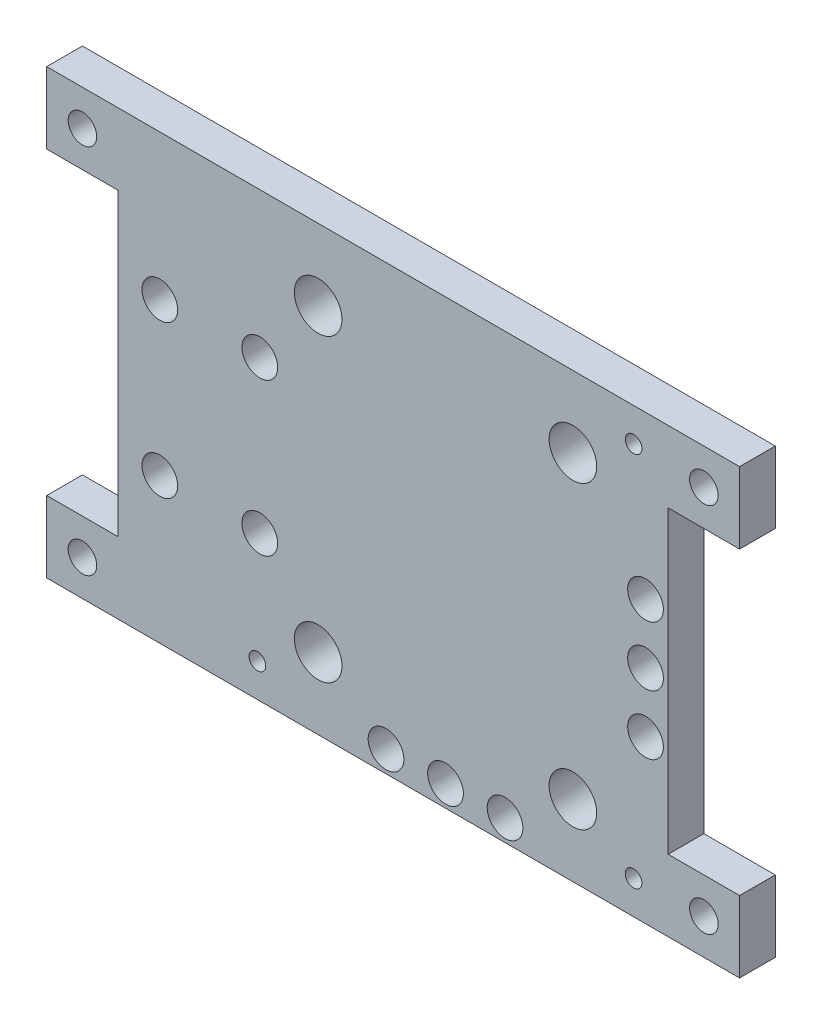
ISO-10303-21;
HEADER;
FILE_DESCRIPTION(('STEP AP214'),'2;1');
FILE_NAME('part.step','',(''),(''),'','','');
FILE_SCHEMA(('AUTOMOTIVE_DESIGN { 1 0 10303 214 1 1 1 1 }'));
ENDSEC;
DATA;
#1=APPLICATION_CONTEXT('core data for automotive mechanical design processes');
#2=APPLICATION_PROTOCOL_DEFINITION('international standard','automotive_design',2000,#1);
#3=PRODUCT_CONTEXT('',#1,'mechanical');
#4=PRODUCT('Part','Part','',(#3));
#5=PRODUCT_RELATED_PRODUCT_CATEGORY('part','',(#4));
#6=PRODUCT_DEFINITION_FORMATION('','',#4);
#7=PRODUCT_DEFINITION_CONTEXT('part definition',#1,'design');
#8=PRODUCT_DEFINITION('design','',#6,#7);
#9=PRODUCT_DEFINITION_SHAPE('','',#8);
#10=(LENGTH_UNIT() NAMED_UNIT(*) SI_UNIT(.MILLI.,.METRE.));
#11=(NAMED_UNIT(*) PLANE_ANGLE_UNIT() SI_UNIT($,.RADIAN.));
#12=(NAMED_UNIT(*) SI_UNIT($,.STERADIAN.) SOLID_ANGLE_UNIT());
#13=UNCERTAINTY_MEASURE_WITH_UNIT(LENGTH_MEASURE(1.E-05),#10,'distance_accuracy_value','');
#14=(GEOMETRIC_REPRESENTATION_CONTEXT(3) GLOBAL_UNCERTAINTY_ASSIGNED_CONTEXT((#13)) GLOBAL_UNIT_ASSIGNED_CONTEXT((#10,
#11,#12)) REPRESENTATION_CONTEXT('',''));
#15=CARTESIAN_POINT('',(0.,0.,0.));
#16=DIRECTION('',(0.,0.,1.));
#17=DIRECTION('',(1.,0.,0.));
#18=AXIS2_PLACEMENT_3D('',#15,#16,#17);
#19=CARTESIAN_POINT('',(-11.55,9.3,1.5));
#20=DIRECTION('',(1.,0.,0.));
#21=DIRECTION('',(0.,1.,0.));
#22=AXIS2_PLACEMENT_3D('',#19,#20,#21);
#23=PLANE('',#22);
#24=DIRECTION('',(0.,0.,-1.));
#25=VECTOR('',#24,1.);
#26=CARTESIAN_POINT('',(-11.55,-6.3,1.5));
#27=LINE('',#26,#25);
#28=CARTESIAN_POINT('',(-11.55,-6.3,1.5));
#29=VERTEX_POINT('',#28);
#30=CARTESIAN_POINT('',(-11.55,-6.3,0.));
#31=VERTEX_POINT('',#30);
#32=EDGE_CURVE('E116',#29,#31,#27,.T.);
#33=ORIENTED_EDGE('',*,*,#32,.F.);
#34=DIRECTION('',(0.,-1.,0.));
#35=VECTOR('',#34,1.);
#36=CARTESIAN_POINT('',(-11.55,9.3,1.5));
#37=LINE('',#36,#35);
#38=CARTESIAN_POINT('',(-11.55,6.3,1.5));
#39=VERTEX_POINT('',#38);
#40=EDGE_CURVE('E12',#39,#29,#37,.T.);
#41=ORIENTED_EDGE('',*,*,#40,.F.);
#42=DIRECTION('',(0.,0.,-1.));
#43=VECTOR('',#42,1.);
#44=CARTESIAN_POINT('',(-11.55,6.3,1.5));
#45=LINE('',#44,#43);
#46=CARTESIAN_POINT('',(-11.55,6.3,0.));
#47=VERTEX_POINT('',#46);
#48=EDGE_CURVE('E229',#39,#47,#45,.T.);
#49=ORIENTED_EDGE('',*,*,#48,.T.);
#50=DIRECTION('',(0.,-1.,0.));
#51=VECTOR('',#50,1.);
#52=CARTESIAN_POINT('',(-11.55,9.3,0.));
#53=LINE('',#52,#51);
#54=EDGE_CURVE('E103',#47,#31,#53,.T.);
#55=ORIENTED_EDGE('',*,*,#54,.T.);
#56=EDGE_LOOP('',(#33,#41,#49,#55));
#57=FACE_BOUND('',#56,.T.);
#58=ADVANCED_FACE('F99',(#57),#23,.F.);
#59=CARTESIAN_POINT('',(11.55,9.3,1.5));
#60=DIRECTION('',(1.,0.,0.));
#61=DIRECTION('',(0.,0.,-1.));
#62=AXIS2_PLACEMENT_3D('',#59,#60,#61);
#63=PLANE('',#62);
#64=DIRECTION('',(0.,-1.,0.));
#65=VECTOR('',#64,1.);
#66=CARTESIAN_POINT('',(11.55,9.3,0.));
#67=LINE('',#66,#65);
#68=CARTESIAN_POINT('',(11.55,6.3,0.));
#69=VERTEX_POINT('',#68);
#70=CARTESIAN_POINT('',(11.55,-6.3,0.));
#71=VERTEX_POINT('',#70);
#72=EDGE_CURVE('E201',#69,#71,#67,.T.);
#73=ORIENTED_EDGE('',*,*,#72,.F.);
#74=DIRECTION('',(0.,0.,-1.));
#75=VECTOR('',#74,1.);
#76=CARTESIAN_POINT('',(11.55,6.3,1.5));
#77=LINE('',#76,#75);
#78=CARTESIAN_POINT('',(11.55,6.3,1.5));
#79=VERTEX_POINT('',#78);
#80=EDGE_CURVE('E250',#79,#69,#77,.T.);
#81=ORIENTED_EDGE('',*,*,#80,.F.);
#82=DIRECTION('',(0.,-1.,0.));
#83=VECTOR('',#82,1.);
#84=CARTESIAN_POINT('',(11.55,9.3,1.5));
#85=LINE('',#84,#83);
#86=CARTESIAN_POINT('',(11.55,-6.3,1.5));
#87=VERTEX_POINT('',#86);
#88=EDGE_CURVE('E402',#79,#87,#85,.T.);
#89=ORIENTED_EDGE('',*,*,#88,.T.);
#90=DIRECTION('',(0.,0.,-1.));
#91=VECTOR('',#90,1.);
#92=CARTESIAN_POINT('',(11.55,-6.3,1.5));
#93=LINE('',#92,#91);
#94=EDGE_CURVE('E288',#87,#71,#93,.T.);
#95=ORIENTED_EDGE('',*,*,#94,.T.);
#96=EDGE_LOOP('',(#73,#81,#89,#95));
#97=FACE_BOUND('',#96,.T.);
#98=ADVANCED_FACE('F416',(#97),#63,.T.);
#99=CARTESIAN_POINT('',(-11.55,9.3,1.5));
#100=DIRECTION('',(0.,1.,0.));
#101=DIRECTION('',(0.,0.,1.));
#102=AXIS2_PLACEMENT_3D('',#99,#100,#101);
#103=PLANE('',#102);
#104=DIRECTION('',(1.,0.,0.));
#105=VECTOR('',#104,1.);
#106=CARTESIAN_POINT('',(-11.55,9.3,0.));
#107=LINE('',#106,#105);
#108=CARTESIAN_POINT('',(-14.55,9.3,0.));
#109=VERTEX_POINT('',#108);
#110=CARTESIAN_POINT('',(14.55,9.3,0.));
#111=VERTEX_POINT('',#110);
#112=EDGE_CURVE('E397',#109,#111,#107,.T.);
#113=ORIENTED_EDGE('',*,*,#112,.F.);
#114=DIRECTION('',(0.,0.,-1.));
#115=VECTOR('',#114,1.);
#116=CARTESIAN_POINT('',(-14.55,9.3,1.5));
#117=LINE('',#116,#115);
#118=CARTESIAN_POINT('',(-14.55,9.3,1.5));
#119=VERTEX_POINT('',#118);
#120=EDGE_CURVE('E226',#119,#109,#117,.T.);
#121=ORIENTED_EDGE('',*,*,#120,.F.);
#122=DIRECTION('',(1.,0.,0.));
#123=VECTOR('',#122,1.);
#124=CARTESIAN_POINT('',(-11.55,9.3,1.5));
#125=LINE('',#124,#123);
#126=CARTESIAN_POINT('',(14.55,9.3,1.5));
#127=VERTEX_POINT('',#126);
#128=EDGE_CURVE('E400',#119,#127,#125,.T.);
#129=ORIENTED_EDGE('',*,*,#128,.T.);
#130=DIRECTION('',(0.,0.,-1.));
#131=VECTOR('',#130,1.);
#132=CARTESIAN_POINT('',(14.55,9.3,1.5));
#133=LINE('',#132,#131);
#134=EDGE_CURVE('E256',#127,#111,#133,.T.);
#135=ORIENTED_EDGE('',*,*,#134,.T.);
#136=EDGE_LOOP('',(#113,#121,#129,#135));
#137=FACE_BOUND('',#136,.T.);
#138=ADVANCED_FACE('F101',(#137),#103,.T.);
#139=CARTESIAN_POINT('',(-11.55,-9.3,1.5));
#140=DIRECTION('',(0.,1.,0.));
#141=DIRECTION('',(0.,0.,1.));
#142=AXIS2_PLACEMENT_3D('',#139,#140,#141);
#143=PLANE('',#142);
#144=DIRECTION('',(1.,0.,0.));
#145=VECTOR('',#144,1.);
#146=CARTESIAN_POINT('',(-11.55,-9.3,0.));
#147=LINE('',#146,#145);
#148=CARTESIAN_POINT('',(-14.55,-9.3,0.));
#149=VERTEX_POINT('',#148);
#150=CARTESIAN_POINT('',(14.55,-9.3,0.));
#151=VERTEX_POINT('',#150);
#152=EDGE_CURVE('E189',#149,#151,#147,.T.);
#153=ORIENTED_EDGE('',*,*,#152,.T.);
#154=DIRECTION('',(0.,0.,-1.));
#155=VECTOR('',#154,1.);
#156=CARTESIAN_POINT('',(14.55,-9.3,1.5));
#157=LINE('',#156,#155);
#158=CARTESIAN_POINT('',(14.55,-9.3,1.5));
#159=VERTEX_POINT('',#158);
#160=EDGE_CURVE('E291',#159,#151,#157,.T.);
#161=ORIENTED_EDGE('',*,*,#160,.F.);
#162=DIRECTION('',(1.,0.,0.));
#163=VECTOR('',#162,1.);
#164=CARTESIAN_POINT('',(-11.55,-9.3,1.5));
#165=LINE('',#164,#163);
#166=CARTESIAN_POINT('',(-14.55,-9.3,1.5));
#167=VERTEX_POINT('',#166);
#168=EDGE_CURVE('E108',#167,#159,#165,.T.);
#169=ORIENTED_EDGE('',*,*,#168,.F.);
#170=DIRECTION('',(0.,0.,-1.));
#171=VECTOR('',#170,1.);
#172=CARTESIAN_POINT('',(-14.55,-9.3,1.5));
#173=LINE('',#172,#171);
#174=EDGE_CURVE('E203',#167,#149,#173,.T.);
#175=ORIENTED_EDGE('',*,*,#174,.T.);
#176=EDGE_LOOP('',(#153,#161,#169,#175));
#177=FACE_BOUND('',#176,.T.);
#178=ADVANCED_FACE('F204',(#177),#143,.F.);
#179=CARTESIAN_POINT('',(0.,0.,1.5));
#180=DIRECTION('',(0.,0.,-1.));
#181=DIRECTION('',(-1.,0.,0.));
#182=AXIS2_PLACEMENT_3D('',#179,#180,#181);
#183=PLANE('',#182);
#184=CARTESIAN_POINT('',(-5.6,3.19999999999996,1.5));
#185=DIRECTION('',(0.,0.,-1.));
#186=DIRECTION('',(-1.,0.,0.));
#187=AXIS2_PLACEMENT_3D('',#184,#185,#186);
#188=CIRCLE('',#187,0.75);
#189=CARTESIAN_POINT('',(-6.35,3.19999999999996,1.5));
#190=VERTEX_POINT('',#189);
#191=EDGE_CURVE('E301',#190,#190,#188,.T.);
#192=ORIENTED_EDGE('',*,*,#191,.T.);
#193=EDGE_LOOP('',(#192));
#194=FACE_BOUND('',#193,.T.);
#195=CARTESIAN_POINT('',(-3.15,6.29999999999996,1.5));
#196=DIRECTION('',(0.,0.,-1.));
#197=DIRECTION('',(-1.,0.,0.));
#198=AXIS2_PLACEMENT_3D('',#195,#196,#197);
#199=CIRCLE('',#198,0.999999999999999);
#200=CARTESIAN_POINT('',(-4.15,6.29999999999996,1.5));
#201=VERTEX_POINT('',#200);
#202=EDGE_CURVE('E362',#201,#201,#199,.T.);
#203=ORIENTED_EDGE('',*,*,#202,.T.);
#204=EDGE_LOOP('',(#203));
#205=FACE_BOUND('',#204,.T.);
#206=CARTESIAN_POINT('',(10.1,7.89999999999996,1.5));
#207=DIRECTION('',(0.,0.,-1.));
#208=DIRECTION('',(-1.,0.,0.));
#209=AXIS2_PLACEMENT_3D('',#206,#207,#208);
#210=CIRCLE('',#209,0.349999999999999);
#211=CARTESIAN_POINT('',(9.74999999999998,7.89999999999996,1.5));
#212=VERTEX_POINT('',#211);
#213=EDGE_CURVE('E356',#212,#212,#210,.T.);
#214=ORIENTED_EDGE('',*,*,#213,.T.);
#215=EDGE_LOOP('',(#214));
#216=FACE_BOUND('',#215,.T.);
#217=CARTESIAN_POINT('',(7.55,6.29999999999996,1.5));
#218=DIRECTION('',(0.,0.,-1.));
#219=DIRECTION('',(-1.,0.,0.));
#220=AXIS2_PLACEMENT_3D('',#217,#218,#219);
#221=CIRCLE('',#220,1.);
#222=CARTESIAN_POINT('',(6.55,6.29999999999996,1.5));
#223=VERTEX_POINT('',#222);
#224=EDGE_CURVE('E350',#223,#223,#221,.T.);
#225=ORIENTED_EDGE('',*,*,#224,.T.);
#226=EDGE_LOOP('',(#225));
#227=FACE_BOUND('',#226,.T.);
#228=CARTESIAN_POINT('',(10.6,2.49999999999996,1.5));
#229=DIRECTION('',(0.,0.,-1.));
#230=DIRECTION('',(-1.,0.,0.));
#231=AXIS2_PLACEMENT_3D('',#228,#229,#230);
#232=CIRCLE('',#231,0.75);
#233=CARTESIAN_POINT('',(9.85,2.49999999999996,1.5));
#234=VERTEX_POINT('',#233);
#235=EDGE_CURVE('E349',#234,#234,#232,.T.);
#236=ORIENTED_EDGE('',*,*,#235,.T.);
#237=EDGE_LOOP('',(#236));
#238=FACE_BOUND('',#237,.T.);
#239=CARTESIAN_POINT('',(10.6,0.,1.5));
#240=DIRECTION('',(0.,0.,-1.));
#241=DIRECTION('',(-1.,0.,0.));
#242=AXIS2_PLACEMENT_3D('',#239,#240,#241);
#243=CIRCLE('',#242,0.75);
#244=CARTESIAN_POINT('',(9.85,0.,1.5));
#245=VERTEX_POINT('',#244);
#246=EDGE_CURVE('E386',#245,#245,#243,.T.);
#247=ORIENTED_EDGE('',*,*,#246,.T.);
#248=EDGE_LOOP('',(#247));
#249=FACE_BOUND('',#248,.T.);
#250=CARTESIAN_POINT('',(10.6,-2.50000000000004,1.5));
#251=DIRECTION('',(0.,0.,-1.));
#252=DIRECTION('',(-1.,0.,0.));
#253=AXIS2_PLACEMENT_3D('',#250,#251,#252);
#254=CIRCLE('',#253,0.75);
#255=CARTESIAN_POINT('',(9.85,-2.50000000000004,1.5));
#256=VERTEX_POINT('',#255);
#257=EDGE_CURVE('E380',#256,#256,#254,.T.);
#258=ORIENTED_EDGE('',*,*,#257,.T.);
#259=EDGE_LOOP('',(#258));
#260=FACE_BOUND('',#259,.T.);
#261=CARTESIAN_POINT('',(7.55,-6.30000000000004,1.5));
#262=DIRECTION('',(0.,0.,-1.));
#263=DIRECTION('',(-1.,0.,0.));
#264=AXIS2_PLACEMENT_3D('',#261,#262,#263);
#265=CIRCLE('',#264,1.);
#266=CARTESIAN_POINT('',(6.55,-6.30000000000004,1.5));
#267=VERTEX_POINT('',#266);
#268=EDGE_CURVE('E374',#267,#267,#265,.T.);
#269=ORIENTED_EDGE('',*,*,#268,.T.);
#270=EDGE_LOOP('',(#269));
#271=FACE_BOUND('',#270,.T.);
#272=CARTESIAN_POINT('',(-9.8,3.19999999999996,1.5));
#273=DIRECTION('',(0.,0.,-1.));
#274=DIRECTION('',(-1.,0.,0.));
#275=AXIS2_PLACEMENT_3D('',#272,#273,#274);
#276=CIRCLE('',#275,0.75);
#277=CARTESIAN_POINT('',(-10.55,3.19999999999996,1.5));
#278=VERTEX_POINT('',#277);
#279=EDGE_CURVE('E302',#278,#278,#276,.T.);
#280=ORIENTED_EDGE('',*,*,#279,.T.);
#281=EDGE_LOOP('',(#280));
#282=FACE_BOUND('',#281,.T.);
#283=CARTESIAN_POINT('',(-9.8,-3.20000000000004,1.5));
#284=DIRECTION('',(0.,0.,-1.));
#285=DIRECTION('',(-1.,0.,0.));
#286=AXIS2_PLACEMENT_3D('',#283,#284,#285);
#287=CIRCLE('',#286,0.75);
#288=CARTESIAN_POINT('',(-10.55,-3.20000000000004,1.5));
#289=VERTEX_POINT('',#288);
#290=EDGE_CURVE('E308',#289,#289,#287,.T.);
#291=ORIENTED_EDGE('',*,*,#290,.T.);
#292=EDGE_LOOP('',(#291));
#293=FACE_BOUND('',#292,.T.);
#294=CARTESIAN_POINT('',(-5.6,-3.20000000000004,1.5));
#295=DIRECTION('',(0.,0.,-1.));
#296=DIRECTION('',(-1.,0.,0.));
#297=AXIS2_PLACEMENT_3D('',#294,#295,#296);
#298=CIRCLE('',#297,0.75);
#299=CARTESIAN_POINT('',(-6.35,-3.20000000000004,1.5));
#300=VERTEX_POINT('',#299);
#301=EDGE_CURVE('E314',#300,#300,#298,.T.);
#302=ORIENTED_EDGE('',*,*,#301,.T.);
#303=EDGE_LOOP('',(#302));
#304=FACE_BOUND('',#303,.T.);
#305=CARTESIAN_POINT('',(-3.15,-6.30000000000004,1.5));
#306=DIRECTION('',(0.,0.,-1.));
#307=DIRECTION('',(-1.,0.,0.));
#308=AXIS2_PLACEMENT_3D('',#305,#306,#307);
#309=CIRCLE('',#308,0.999999999999999);
#310=CARTESIAN_POINT('',(-4.15,-6.30000000000004,1.5));
#311=VERTEX_POINT('',#310);
#312=EDGE_CURVE('E320',#311,#311,#309,.T.);
#313=ORIENTED_EDGE('',*,*,#312,.T.);
#314=EDGE_LOOP('',(#313));
#315=FACE_BOUND('',#314,.T.);
#316=CARTESIAN_POINT('',(-5.7,-7.89999999999966,1.5));
#317=DIRECTION('',(0.,0.,-1.));
#318=DIRECTION('',(-1.,0.,0.));
#319=AXIS2_PLACEMENT_3D('',#316,#317,#318);
#320=CIRCLE('',#319,0.35);
#321=CARTESIAN_POINT('',(-6.05,-7.89999999999966,1.5));
#322=VERTEX_POINT('',#321);
#323=EDGE_CURVE('E326',#322,#322,#320,.T.);
#324=ORIENTED_EDGE('',*,*,#323,.T.);
#325=EDGE_LOOP('',(#324));
#326=FACE_BOUND('',#325,.T.);
#327=CARTESIAN_POINT('',(-0.299999999999998,-8.40000000000004,1.5));
#328=DIRECTION('',(0.,0.,-1.));
#329=DIRECTION('',(-1.,0.,0.));
#330=AXIS2_PLACEMENT_3D('',#327,#328,#329);
#331=CIRCLE('',#330,0.750000000000001);
#332=CARTESIAN_POINT('',(-1.05,-8.40000000000004,1.5));
#333=VERTEX_POINT('',#332);
#334=EDGE_CURVE('E332',#333,#333,#331,.T.);
#335=ORIENTED_EDGE('',*,*,#334,.T.);
#336=EDGE_LOOP('',(#335));
#337=FACE_BOUND('',#336,.T.);
#338=CARTESIAN_POINT('',(2.2,-8.40000000000004,1.5));
#339=DIRECTION('',(0.,0.,-1.));
#340=DIRECTION('',(-1.,0.,0.));
#341=AXIS2_PLACEMENT_3D('',#338,#339,#340);
#342=CIRCLE('',#341,0.750000000000001);
#343=CARTESIAN_POINT('',(1.45,-8.40000000000004,1.5));
#344=VERTEX_POINT('',#343);
#345=EDGE_CURVE('E338',#344,#344,#342,.T.);
#346=ORIENTED_EDGE('',*,*,#345,.T.);
#347=EDGE_LOOP('',(#346));
#348=FACE_BOUND('',#347,.T.);
#349=CARTESIAN_POINT('',(4.7,-8.40000000000004,1.5));
#350=DIRECTION('',(0.,0.,-1.));
#351=DIRECTION('',(-1.,0.,0.));
#352=AXIS2_PLACEMENT_3D('',#349,#350,#351);
#353=CIRCLE('',#352,0.75);
#354=CARTESIAN_POINT('',(3.95,-8.40000000000004,1.5));
#355=VERTEX_POINT('',#354);
#356=EDGE_CURVE('E293',#355,#355,#353,.T.);
#357=ORIENTED_EDGE('',*,*,#356,.T.);
#358=EDGE_LOOP('',(#357));
#359=FACE_BOUND('',#358,.T.);
#360=CARTESIAN_POINT('',(10.1,-7.90000000000003,1.5));
#361=DIRECTION('',(0.,0.,-1.));
#362=DIRECTION('',(-1.,0.,0.));
#363=AXIS2_PLACEMENT_3D('',#360,#361,#362);
#364=CIRCLE('',#363,0.349999999999999);
#365=CARTESIAN_POINT('',(9.74999999999998,-7.90000000000003,1.5));
#366=VERTEX_POINT('',#365);
#367=EDGE_CURVE('E394',#366,#366,#364,.T.);
#368=ORIENTED_EDGE('',*,*,#367,.T.);
#369=EDGE_LOOP('',(#368));
#370=FACE_BOUND('',#369,.T.);
#371=ORIENTED_EDGE('',*,*,#128,.F.);
#372=DIRECTION('',(0.,-1.,0.));
#373=VECTOR('',#372,1.);
#374=CARTESIAN_POINT('',(-14.55,9.3,1.5));
#375=LINE('',#374,#373);
#376=CARTESIAN_POINT('',(-14.55,6.3,1.5));
#377=VERTEX_POINT('',#376);
#378=EDGE_CURVE('E231',#119,#377,#375,.T.);
#379=ORIENTED_EDGE('',*,*,#378,.T.);
#380=DIRECTION('',(-1.,0.,0.));
#381=VECTOR('',#380,1.);
#382=CARTESIAN_POINT('',(-11.55,6.3,1.5));
#383=LINE('',#382,#381);
#384=EDGE_CURVE('E240',#39,#377,#383,.T.);
#385=ORIENTED_EDGE('',*,*,#384,.F.);
#386=ORIENTED_EDGE('',*,*,#40,.T.);
#387=DIRECTION('',(-1.,0.,0.));
#388=VECTOR('',#387,1.);
#389=CARTESIAN_POINT('',(-11.55,-6.3,1.5));
#390=LINE('',#389,#388);
#391=CARTESIAN_POINT('',(-14.55,-6.3,1.5));
#392=VERTEX_POINT('',#391);
#393=EDGE_CURVE('E215',#29,#392,#390,.T.);
#394=ORIENTED_EDGE('',*,*,#393,.T.);
#395=DIRECTION('',(0.,1.,0.));
#396=VECTOR('',#395,1.);
#397=CARTESIAN_POINT('',(-14.55,-9.3,1.5));
#398=LINE('',#397,#396);
#399=EDGE_CURVE('E208',#167,#392,#398,.T.);
#400=ORIENTED_EDGE('',*,*,#399,.F.);
#401=ORIENTED_EDGE('',*,*,#168,.T.);
#402=DIRECTION('',(0.,1.,0.));
#403=VECTOR('',#402,1.);
#404=CARTESIAN_POINT('',(14.55,-9.3,1.5));
#405=LINE('',#404,#403);
#406=CARTESIAN_POINT('',(14.55,-6.3,1.5));
#407=VERTEX_POINT('',#406);
#408=EDGE_CURVE('E286',#159,#407,#405,.T.);
#409=ORIENTED_EDGE('',*,*,#408,.T.);
#410=DIRECTION('',(1.,0.,0.));
#411=VECTOR('',#410,1.);
#412=CARTESIAN_POINT('',(11.55,-6.3,1.5));
#413=LINE('',#412,#411);
#414=EDGE_CURVE('E283',#87,#407,#413,.T.);
#415=ORIENTED_EDGE('',*,*,#414,.F.);
#416=ORIENTED_EDGE('',*,*,#88,.F.);
#417=DIRECTION('',(1.,0.,0.));
#418=VECTOR('',#417,1.);
#419=CARTESIAN_POINT('',(11.55,6.3,1.5));
#420=LINE('',#419,#418);
#421=CARTESIAN_POINT('',(14.55,6.3,1.5));
#422=VERTEX_POINT('',#421);
#423=EDGE_CURVE('E264',#79,#422,#420,.T.);
#424=ORIENTED_EDGE('',*,*,#423,.T.);
#425=DIRECTION('',(0.,-1.,0.));
#426=VECTOR('',#425,1.);
#427=CARTESIAN_POINT('',(14.55,9.3,1.5));
#428=LINE('',#427,#426);
#429=EDGE_CURVE('E259',#127,#422,#428,.T.);
#430=ORIENTED_EDGE('',*,*,#429,.F.);
#431=EDGE_LOOP('',(#371,#379,#385,#386,#394,#400,#401,#409,#415,#416,#424,#430));
#432=FACE_BOUND('',#431,.T.);
#433=CARTESIAN_POINT('',(13.05,-7.8,1.5));
#434=DIRECTION('',(0.,0.,-1.));
#435=DIRECTION('',(-1.,0.,0.));
#436=AXIS2_PLACEMENT_3D('',#433,#434,#435);
#437=CIRCLE('',#436,0.6);
#438=CARTESIAN_POINT('',(12.45,-7.8,1.5));
#439=VERTEX_POINT('',#438);
#440=EDGE_CURVE('E277',#439,#439,#437,.T.);
#441=ORIENTED_EDGE('',*,*,#440,.T.);
#442=EDGE_LOOP('',(#441));
#443=FACE_BOUND('',#442,.T.);
#444=CARTESIAN_POINT('',(13.05,7.8,1.5));
#445=DIRECTION('',(0.,0.,-1.));
#446=DIRECTION('',(-1.,0.,0.));
#447=AXIS2_PLACEMENT_3D('',#444,#445,#446);
#448=CIRCLE('',#447,0.6);
#449=CARTESIAN_POINT('',(12.45,7.8,1.5));
#450=VERTEX_POINT('',#449);
#451=EDGE_CURVE('E267',#450,#450,#448,.T.);
#452=ORIENTED_EDGE('',*,*,#451,.T.);
#453=EDGE_LOOP('',(#452));
#454=FACE_BOUND('',#453,.T.);
#455=CARTESIAN_POINT('',(-13.05,7.8,1.5));
#456=DIRECTION('',(0.,0.,-1.));
#457=DIRECTION('',(-1.,0.,0.));
#458=AXIS2_PLACEMENT_3D('',#455,#456,#457);
#459=CIRCLE('',#458,0.6);
#460=CARTESIAN_POINT('',(-13.65,7.8,1.5));
#461=VERTEX_POINT('',#460);
#462=EDGE_CURVE('E243',#461,#461,#459,.T.);
#463=ORIENTED_EDGE('',*,*,#462,.T.);
#464=EDGE_LOOP('',(#463));
#465=FACE_BOUND('',#464,.T.);
#466=CARTESIAN_POINT('',(-13.05,-7.8,1.5));
#467=DIRECTION('',(0.,0.,-1.));
#468=DIRECTION('',(-1.,0.,0.));
#469=AXIS2_PLACEMENT_3D('',#466,#467,#468);
#470=CIRCLE('',#469,0.6);
#471=CARTESIAN_POINT('',(-13.65,-7.8,1.5));
#472=VERTEX_POINT('',#471);
#473=EDGE_CURVE('E217',#472,#472,#470,.T.);
#474=ORIENTED_EDGE('',*,*,#473,.T.);
#475=EDGE_LOOP('',(#474));
#476=FACE_BOUND('',#475,.T.);
#477=ADVANCED_FACE('F419',(#194,#205,#216,#227,#238,#249,#260,#271,#282,#293,#304,#315,#326,
#337,#348,#359,#370,#432,#443,#454,#465,#476),#183,.F.);
#478=CARTESIAN_POINT('',(0.,0.,0.));
#479=DIRECTION('',(0.,0.,-1.));
#480=DIRECTION('',(-1.,0.,0.));
#481=AXIS2_PLACEMENT_3D('',#478,#479,#480);
#482=PLANE('',#481);
#483=CARTESIAN_POINT('',(-5.6,3.19999999999996,0.));
#484=DIRECTION('',(0.,0.,-1.));
#485=DIRECTION('',(-1.,0.,0.));
#486=AXIS2_PLACEMENT_3D('',#483,#484,#485);
#487=CIRCLE('',#486,0.75);
#488=CARTESIAN_POINT('',(-6.35,3.19999999999996,0.));
#489=VERTEX_POINT('',#488);
#490=EDGE_CURVE('E365',#489,#489,#487,.T.);
#491=ORIENTED_EDGE('',*,*,#490,.F.);
#492=EDGE_LOOP('',(#491));
#493=FACE_BOUND('',#492,.T.);
#494=CARTESIAN_POINT('',(-3.15,6.29999999999996,0.));
#495=DIRECTION('',(0.,0.,-1.));
#496=DIRECTION('',(-1.,0.,0.));
#497=AXIS2_PLACEMENT_3D('',#494,#495,#496);
#498=CIRCLE('',#497,0.999999999999999);
#499=CARTESIAN_POINT('',(-4.15,6.29999999999996,0.));
#500=VERTEX_POINT('',#499);
#501=EDGE_CURVE('E359',#500,#500,#498,.T.);
#502=ORIENTED_EDGE('',*,*,#501,.F.);
#503=EDGE_LOOP('',(#502));
#504=FACE_BOUND('',#503,.T.);
#505=CARTESIAN_POINT('',(10.1,7.89999999999996,0.));
#506=DIRECTION('',(0.,0.,-1.));
#507=DIRECTION('',(-1.,0.,0.));
#508=AXIS2_PLACEMENT_3D('',#505,#506,#507);
#509=CIRCLE('',#508,0.349999999999999);
#510=CARTESIAN_POINT('',(9.74999999999998,7.89999999999996,0.));
#511=VERTEX_POINT('',#510);
#512=EDGE_CURVE('E353',#511,#511,#509,.T.);
#513=ORIENTED_EDGE('',*,*,#512,.F.);
#514=EDGE_LOOP('',(#513));
#515=FACE_BOUND('',#514,.T.);
#516=CARTESIAN_POINT('',(7.55,6.29999999999996,0.));
#517=DIRECTION('',(0.,0.,-1.));
#518=DIRECTION('',(-1.,0.,0.));
#519=AXIS2_PLACEMENT_3D('',#516,#517,#518);
#520=CIRCLE('',#519,1.);
#521=CARTESIAN_POINT('',(6.55,6.29999999999996,0.));
#522=VERTEX_POINT('',#521);
#523=EDGE_CURVE('E346',#522,#522,#520,.T.);
#524=ORIENTED_EDGE('',*,*,#523,.F.);
#525=EDGE_LOOP('',(#524));
#526=FACE_BOUND('',#525,.T.);
#527=CARTESIAN_POINT('',(10.6,2.49999999999996,0.));
#528=DIRECTION('',(0.,0.,-1.));
#529=DIRECTION('',(-1.,0.,0.));
#530=AXIS2_PLACEMENT_3D('',#527,#528,#529);
#531=CIRCLE('',#530,0.75);
#532=CARTESIAN_POINT('',(9.85,2.49999999999996,0.));
#533=VERTEX_POINT('',#532);
#534=EDGE_CURVE('E389',#533,#533,#531,.T.);
#535=ORIENTED_EDGE('',*,*,#534,.F.);
#536=EDGE_LOOP('',(#535));
#537=FACE_BOUND('',#536,.T.);
#538=CARTESIAN_POINT('',(10.6,0.,0.));
#539=DIRECTION('',(0.,0.,-1.));
#540=DIRECTION('',(-1.,0.,0.));
#541=AXIS2_PLACEMENT_3D('',#538,#539,#540);
#542=CIRCLE('',#541,0.75);
#543=CARTESIAN_POINT('',(9.85,0.,0.));
#544=VERTEX_POINT('',#543);
#545=EDGE_CURVE('E383',#544,#544,#542,.T.);
#546=ORIENTED_EDGE('',*,*,#545,.F.);
#547=EDGE_LOOP('',(#546));
#548=FACE_BOUND('',#547,.T.);
#549=CARTESIAN_POINT('',(10.6,-2.50000000000004,0.));
#550=DIRECTION('',(0.,0.,-1.));
#551=DIRECTION('',(-1.,0.,0.));
#552=AXIS2_PLACEMENT_3D('',#549,#550,#551);
#553=CIRCLE('',#552,0.75);
#554=CARTESIAN_POINT('',(9.85,-2.50000000000004,0.));
#555=VERTEX_POINT('',#554);
#556=EDGE_CURVE('E377',#555,#555,#553,.T.);
#557=ORIENTED_EDGE('',*,*,#556,.F.);
#558=EDGE_LOOP('',(#557));
#559=FACE_BOUND('',#558,.T.);
#560=CARTESIAN_POINT('',(7.55,-6.30000000000004,0.));
#561=DIRECTION('',(0.,0.,-1.));
#562=DIRECTION('',(-1.,0.,0.));
#563=AXIS2_PLACEMENT_3D('',#560,#561,#562);
#564=CIRCLE('',#563,1.);
#565=CARTESIAN_POINT('',(6.55,-6.30000000000004,0.));
#566=VERTEX_POINT('',#565);
#567=EDGE_CURVE('E370',#566,#566,#564,.T.);
#568=ORIENTED_EDGE('',*,*,#567,.F.);
#569=EDGE_LOOP('',(#568));
#570=FACE_BOUND('',#569,.T.);
#571=CARTESIAN_POINT('',(-9.8,3.19999999999996,0.));
#572=DIRECTION('',(0.,0.,-1.));
#573=DIRECTION('',(-1.,0.,0.));
#574=AXIS2_PLACEMENT_3D('',#571,#572,#573);
#575=CIRCLE('',#574,0.75);
#576=CARTESIAN_POINT('',(-10.55,3.19999999999996,0.));
#577=VERTEX_POINT('',#576);
#578=EDGE_CURVE('E298',#577,#577,#575,.T.);
#579=ORIENTED_EDGE('',*,*,#578,.F.);
#580=EDGE_LOOP('',(#579));
#581=FACE_BOUND('',#580,.T.);
#582=CARTESIAN_POINT('',(-9.8,-3.20000000000004,0.));
#583=DIRECTION('',(0.,0.,-1.));
#584=DIRECTION('',(-1.,0.,0.));
#585=AXIS2_PLACEMENT_3D('',#582,#583,#584);
#586=CIRCLE('',#585,0.75);
#587=CARTESIAN_POINT('',(-10.55,-3.20000000000004,0.));
#588=VERTEX_POINT('',#587);
#589=EDGE_CURVE('E305',#588,#588,#586,.T.);
#590=ORIENTED_EDGE('',*,*,#589,.F.);
#591=EDGE_LOOP('',(#590));
#592=FACE_BOUND('',#591,.T.);
#593=CARTESIAN_POINT('',(-5.6,-3.20000000000004,0.));
#594=DIRECTION('',(0.,0.,-1.));
#595=DIRECTION('',(-1.,0.,0.));
#596=AXIS2_PLACEMENT_3D('',#593,#594,#595);
#597=CIRCLE('',#596,0.75);
#598=CARTESIAN_POINT('',(-6.35,-3.20000000000004,0.));
#599=VERTEX_POINT('',#598);
#600=EDGE_CURVE('E311',#599,#599,#597,.T.);
#601=ORIENTED_EDGE('',*,*,#600,.F.);
#602=EDGE_LOOP('',(#601));
#603=FACE_BOUND('',#602,.T.);
#604=CARTESIAN_POINT('',(-3.15,-6.30000000000004,0.));
#605=DIRECTION('',(0.,0.,-1.));
#606=DIRECTION('',(-1.,0.,0.));
#607=AXIS2_PLACEMENT_3D('',#604,#605,#606);
#608=CIRCLE('',#607,0.999999999999999);
#609=CARTESIAN_POINT('',(-4.15,-6.30000000000004,0.));
#610=VERTEX_POINT('',#609);
#611=EDGE_CURVE('E317',#610,#610,#608,.T.);
#612=ORIENTED_EDGE('',*,*,#611,.F.);
#613=EDGE_LOOP('',(#612));
#614=FACE_BOUND('',#613,.T.);
#615=CARTESIAN_POINT('',(-5.7,-7.89999999999966,0.));
#616=DIRECTION('',(0.,0.,-1.));
#617=DIRECTION('',(-1.,0.,0.));
#618=AXIS2_PLACEMENT_3D('',#615,#616,#617);
#619=CIRCLE('',#618,0.35);
#620=CARTESIAN_POINT('',(-6.05,-7.89999999999966,0.));
#621=VERTEX_POINT('',#620);
#622=EDGE_CURVE('E323',#621,#621,#619,.T.);
#623=ORIENTED_EDGE('',*,*,#622,.F.);
#624=EDGE_LOOP('',(#623));
#625=FACE_BOUND('',#624,.T.);
#626=CARTESIAN_POINT('',(-0.299999999999998,-8.40000000000004,0.));
#627=DIRECTION('',(0.,0.,-1.));
#628=DIRECTION('',(-1.,0.,0.));
#629=AXIS2_PLACEMENT_3D('',#626,#627,#628);
#630=CIRCLE('',#629,0.750000000000001);
#631=CARTESIAN_POINT('',(-1.05,-8.40000000000004,0.));
#632=VERTEX_POINT('',#631);
#633=EDGE_CURVE('E329',#632,#632,#630,.T.);
#634=ORIENTED_EDGE('',*,*,#633,.F.);
#635=EDGE_LOOP('',(#634));
#636=FACE_BOUND('',#635,.T.);
#637=CARTESIAN_POINT('',(2.2,-8.40000000000004,0.));
#638=DIRECTION('',(0.,0.,-1.));
#639=DIRECTION('',(-1.,0.,0.));
#640=AXIS2_PLACEMENT_3D('',#637,#638,#639);
#641=CIRCLE('',#640,0.750000000000001);
#642=CARTESIAN_POINT('',(1.45,-8.40000000000004,0.));
#643=VERTEX_POINT('',#642);
#644=EDGE_CURVE('E335',#643,#643,#641,.T.);
#645=ORIENTED_EDGE('',*,*,#644,.F.);
#646=EDGE_LOOP('',(#645));
#647=FACE_BOUND('',#646,.T.);
#648=CARTESIAN_POINT('',(4.7,-8.40000000000004,0.));
#649=DIRECTION('',(0.,0.,-1.));
#650=DIRECTION('',(-1.,0.,0.));
#651=AXIS2_PLACEMENT_3D('',#648,#649,#650);
#652=CIRCLE('',#651,0.75);
#653=CARTESIAN_POINT('',(3.95,-8.40000000000004,0.));
#654=VERTEX_POINT('',#653);
#655=EDGE_CURVE('E341',#654,#654,#652,.T.);
#656=ORIENTED_EDGE('',*,*,#655,.F.);
#657=EDGE_LOOP('',(#656));
#658=FACE_BOUND('',#657,.T.);
#659=CARTESIAN_POINT('',(10.1,-7.90000000000003,0.));
#660=DIRECTION('',(0.,0.,-1.));
#661=DIRECTION('',(-1.,0.,0.));
#662=AXIS2_PLACEMENT_3D('',#659,#660,#661);
#663=CIRCLE('',#662,0.349999999999999);
#664=CARTESIAN_POINT('',(9.74999999999998,-7.90000000000003,0.));
#665=VERTEX_POINT('',#664);
#666=EDGE_CURVE('E373',#665,#665,#663,.T.);
#667=ORIENTED_EDGE('',*,*,#666,.F.);
#668=EDGE_LOOP('',(#667));
#669=FACE_BOUND('',#668,.T.);
#670=ORIENTED_EDGE('',*,*,#112,.T.);
#671=DIRECTION('',(0.,-1.,0.));
#672=VECTOR('',#671,1.);
#673=CARTESIAN_POINT('',(14.55,9.3,0.));
#674=LINE('',#673,#672);
#675=CARTESIAN_POINT('',(14.55,6.3,0.));
#676=VERTEX_POINT('',#675);
#677=EDGE_CURVE('E260',#111,#676,#674,.T.);
#678=ORIENTED_EDGE('',*,*,#677,.T.);
#679=DIRECTION('',(1.,0.,0.));
#680=VECTOR('',#679,1.);
#681=CARTESIAN_POINT('',(11.55,6.3,0.));
#682=LINE('',#681,#680);
#683=EDGE_CURVE('E263',#69,#676,#682,.T.);
#684=ORIENTED_EDGE('',*,*,#683,.F.);
#685=ORIENTED_EDGE('',*,*,#72,.T.);
#686=DIRECTION('',(1.,0.,0.));
#687=VECTOR('',#686,1.);
#688=CARTESIAN_POINT('',(11.55,-6.3,0.));
#689=LINE('',#688,#687);
#690=CARTESIAN_POINT('',(14.55,-6.3,0.));
#691=VERTEX_POINT('',#690);
#692=EDGE_CURVE('E280',#71,#691,#689,.T.);
#693=ORIENTED_EDGE('',*,*,#692,.T.);
#694=DIRECTION('',(0.,1.,0.));
#695=VECTOR('',#694,1.);
#696=CARTESIAN_POINT('',(14.55,-9.3,0.));
#697=LINE('',#696,#695);
#698=EDGE_CURVE('E197',#151,#691,#697,.T.);
#699=ORIENTED_EDGE('',*,*,#698,.F.);
#700=ORIENTED_EDGE('',*,*,#152,.F.);
#701=DIRECTION('',(0.,1.,0.));
#702=VECTOR('',#701,1.);
#703=CARTESIAN_POINT('',(-14.55,-9.3,0.));
#704=LINE('',#703,#702);
#705=CARTESIAN_POINT('',(-14.55,-6.3,0.));
#706=VERTEX_POINT('',#705);
#707=EDGE_CURVE('E194',#149,#706,#704,.T.);
#708=ORIENTED_EDGE('',*,*,#707,.T.);
#709=DIRECTION('',(-1.,0.,0.));
#710=VECTOR('',#709,1.);
#711=CARTESIAN_POINT('',(-11.55,-6.3,0.));
#712=LINE('',#711,#710);
#713=EDGE_CURVE('E214',#31,#706,#712,.T.);
#714=ORIENTED_EDGE('',*,*,#713,.F.);
#715=ORIENTED_EDGE('',*,*,#54,.F.);
#716=DIRECTION('',(-1.,0.,0.));
#717=VECTOR('',#716,1.);
#718=CARTESIAN_POINT('',(-11.55,6.3,0.));
#719=LINE('',#718,#717);
#720=CARTESIAN_POINT('',(-14.55,6.3,0.));
#721=VERTEX_POINT('',#720);
#722=EDGE_CURVE('E239',#47,#721,#719,.T.);
#723=ORIENTED_EDGE('',*,*,#722,.T.);
#724=DIRECTION('',(0.,-1.,0.));
#725=VECTOR('',#724,1.);
#726=CARTESIAN_POINT('',(-14.55,9.3,0.));
#727=LINE('',#726,#725);
#728=EDGE_CURVE('E236',#109,#721,#727,.T.);
#729=ORIENTED_EDGE('',*,*,#728,.F.);
#730=EDGE_LOOP('',(#670,#678,#684,#685,#693,#699,#700,#708,#714,#715,#723,#729));
#731=FACE_BOUND('',#730,.T.);
#732=CARTESIAN_POINT('',(13.05,-7.8,0.));
#733=DIRECTION('',(0.,0.,-1.));
#734=DIRECTION('',(-1.,0.,0.));
#735=AXIS2_PLACEMENT_3D('',#732,#733,#734);
#736=CIRCLE('',#735,0.6);
#737=CARTESIAN_POINT('',(12.45,-7.8,0.));
#738=VERTEX_POINT('',#737);
#739=EDGE_CURVE('E274',#738,#738,#736,.T.);
#740=ORIENTED_EDGE('',*,*,#739,.F.);
#741=EDGE_LOOP('',(#740));
#742=FACE_BOUND('',#741,.T.);
#743=CARTESIAN_POINT('',(13.05,7.8,0.));
#744=DIRECTION('',(0.,0.,-1.));
#745=DIRECTION('',(-1.,0.,0.));
#746=AXIS2_PLACEMENT_3D('',#743,#744,#745);
#747=CIRCLE('',#746,0.6);
#748=CARTESIAN_POINT('',(12.45,7.8,0.));
#749=VERTEX_POINT('',#748);
#750=EDGE_CURVE('E271',#749,#749,#747,.T.);
#751=ORIENTED_EDGE('',*,*,#750,.F.);
#752=EDGE_LOOP('',(#751));
#753=FACE_BOUND('',#752,.T.);
#754=CARTESIAN_POINT('',(-13.05,7.8,0.));
#755=DIRECTION('',(0.,0.,-1.));
#756=DIRECTION('',(-1.,0.,0.));
#757=AXIS2_PLACEMENT_3D('',#754,#755,#756);
#758=CIRCLE('',#757,0.6);
#759=CARTESIAN_POINT('',(-13.65,7.8,0.));
#760=VERTEX_POINT('',#759);
#761=EDGE_CURVE('E247',#760,#760,#758,.T.);
#762=ORIENTED_EDGE('',*,*,#761,.F.);
#763=EDGE_LOOP('',(#762));
#764=FACE_BOUND('',#763,.T.);
#765=CARTESIAN_POINT('',(-13.05,-7.8,0.));
#766=DIRECTION('',(0.,0.,-1.));
#767=DIRECTION('',(-1.,0.,0.));
#768=AXIS2_PLACEMENT_3D('',#765,#766,#767);
#769=CIRCLE('',#768,0.6);
#770=CARTESIAN_POINT('',(-13.65,-7.8,0.));
#771=VERTEX_POINT('',#770);
#772=EDGE_CURVE('E223',#771,#771,#769,.T.);
#773=ORIENTED_EDGE('',*,*,#772,.F.);
#774=EDGE_LOOP('',(#773));
#775=FACE_BOUND('',#774,.T.);
#776=ADVANCED_FACE('F191',(#493,#504,#515,#526,#537,#548,#559,#570,#581,#592,#603,#614,#625,
#636,#647,#658,#669,#731,#742,#753,#764,#775),#482,.T.);
#777=CARTESIAN_POINT('',(10.1,-7.90000000000003,1.5));
#778=DIRECTION('',(0.,0.,-1.));
#779=DIRECTION('',(-1.,0.,0.));
#780=AXIS2_PLACEMENT_3D('',#777,#778,#779);
#781=CYLINDRICAL_SURFACE('',#780,0.349999999999999);
#782=ORIENTED_EDGE('',*,*,#367,.F.);
#783=EDGE_LOOP('',(#782));
#784=FACE_BOUND('',#783,.T.);
#785=ORIENTED_EDGE('',*,*,#666,.T.);
#786=EDGE_LOOP('',(#785));
#787=FACE_BOUND('',#786,.T.);
#788=ADVANCED_FACE('F510',(#784,#787),#781,.F.);
#789=CARTESIAN_POINT('',(4.7,-8.40000000000004,1.5));
#790=DIRECTION('',(0.,0.,-1.));
#791=DIRECTION('',(-1.,0.,0.));
#792=AXIS2_PLACEMENT_3D('',#789,#790,#791);
#793=CYLINDRICAL_SURFACE('',#792,0.75);
#794=ORIENTED_EDGE('',*,*,#356,.F.);
#795=EDGE_LOOP('',(#794));
#796=FACE_BOUND('',#795,.T.);
#797=ORIENTED_EDGE('',*,*,#655,.T.);
#798=EDGE_LOOP('',(#797));
#799=FACE_BOUND('',#798,.T.);
#800=ADVANCED_FACE('F523',(#796,#799),#793,.F.);
#801=CARTESIAN_POINT('',(2.2,-8.40000000000004,1.5));
#802=DIRECTION('',(0.,0.,-1.));
#803=DIRECTION('',(-1.,0.,0.));
#804=AXIS2_PLACEMENT_3D('',#801,#802,#803);
#805=CYLINDRICAL_SURFACE('',#804,0.750000000000001);
#806=ORIENTED_EDGE('',*,*,#345,.F.);
#807=EDGE_LOOP('',(#806));
#808=FACE_BOUND('',#807,.T.);
#809=ORIENTED_EDGE('',*,*,#644,.T.);
#810=EDGE_LOOP('',(#809));
#811=FACE_BOUND('',#810,.T.);
#812=ADVANCED_FACE('F562',(#808,#811),#805,.F.);
#813=CARTESIAN_POINT('',(-0.299999999999998,-8.40000000000004,1.5));
#814=DIRECTION('',(0.,0.,-1.));
#815=DIRECTION('',(-1.,0.,0.));
#816=AXIS2_PLACEMENT_3D('',#813,#814,#815);
#817=CYLINDRICAL_SURFACE('',#816,0.750000000000001);
#818=ORIENTED_EDGE('',*,*,#334,.F.);
#819=EDGE_LOOP('',(#818));
#820=FACE_BOUND('',#819,.T.);
#821=ORIENTED_EDGE('',*,*,#633,.T.);
#822=EDGE_LOOP('',(#821));
#823=FACE_BOUND('',#822,.T.);
#824=ADVANCED_FACE('F568',(#820,#823),#817,.F.);
#825=CARTESIAN_POINT('',(-5.7,-7.89999999999966,1.5));
#826=DIRECTION('',(0.,0.,-1.));
#827=DIRECTION('',(-1.,0.,0.));
#828=AXIS2_PLACEMENT_3D('',#825,#826,#827);
#829=CYLINDRICAL_SURFACE('',#828,0.35);
#830=ORIENTED_EDGE('',*,*,#323,.F.);
#831=EDGE_LOOP('',(#830));
#832=FACE_BOUND('',#831,.T.);
#833=ORIENTED_EDGE('',*,*,#622,.T.);
#834=EDGE_LOOP('',(#833));
#835=FACE_BOUND('',#834,.T.);
#836=ADVANCED_FACE('F633',(#832,#835),#829,.F.);
#837=CARTESIAN_POINT('',(-3.15,-6.30000000000004,1.5));
#838=DIRECTION('',(0.,0.,-1.));
#839=DIRECTION('',(-1.,0.,0.));
#840=AXIS2_PLACEMENT_3D('',#837,#838,#839);
#841=CYLINDRICAL_SURFACE('',#840,0.999999999999999);
#842=ORIENTED_EDGE('',*,*,#312,.F.);
#843=EDGE_LOOP('',(#842));
#844=FACE_BOUND('',#843,.T.);
#845=ORIENTED_EDGE('',*,*,#611,.T.);
#846=EDGE_LOOP('',(#845));
#847=FACE_BOUND('',#846,.T.);
#848=ADVANCED_FACE('F637',(#844,#847),#841,.F.);
#849=CARTESIAN_POINT('',(-5.6,-3.20000000000004,1.5));
#850=DIRECTION('',(0.,0.,-1.));
#851=DIRECTION('',(-1.,0.,0.));
#852=AXIS2_PLACEMENT_3D('',#849,#850,#851);
#853=CYLINDRICAL_SURFACE('',#852,0.75);
#854=ORIENTED_EDGE('',*,*,#301,.F.);
#855=EDGE_LOOP('',(#854));
#856=FACE_BOUND('',#855,.T.);
#857=ORIENTED_EDGE('',*,*,#600,.T.);
#858=EDGE_LOOP('',(#857));
#859=FACE_BOUND('',#858,.T.);
#860=ADVANCED_FACE('F643',(#856,#859),#853,.F.);
#861=CARTESIAN_POINT('',(-9.8,-3.20000000000004,1.5));
#862=DIRECTION('',(0.,0.,-1.));
#863=DIRECTION('',(-1.,0.,0.));
#864=AXIS2_PLACEMENT_3D('',#861,#862,#863);
#865=CYLINDRICAL_SURFACE('',#864,0.75);
#866=ORIENTED_EDGE('',*,*,#290,.F.);
#867=EDGE_LOOP('',(#866));
#868=FACE_BOUND('',#867,.T.);
#869=ORIENTED_EDGE('',*,*,#589,.T.);
#870=EDGE_LOOP('',(#869));
#871=FACE_BOUND('',#870,.T.);
#872=ADVANCED_FACE('F647',(#868,#871),#865,.F.);
#873=CARTESIAN_POINT('',(-9.8,3.19999999999996,1.5));
#874=DIRECTION('',(0.,0.,-1.));
#875=DIRECTION('',(-1.,0.,0.));
#876=AXIS2_PLACEMENT_3D('',#873,#874,#875);
#877=CYLINDRICAL_SURFACE('',#876,0.75);
#878=ORIENTED_EDGE('',*,*,#279,.F.);
#879=EDGE_LOOP('',(#878));
#880=FACE_BOUND('',#879,.T.);
#881=ORIENTED_EDGE('',*,*,#578,.T.);
#882=EDGE_LOOP('',(#881));
#883=FACE_BOUND('',#882,.T.);
#884=ADVANCED_FACE('F590',(#880,#883),#877,.F.);
#885=CARTESIAN_POINT('',(7.55,-6.30000000000004,1.5));
#886=DIRECTION('',(0.,0.,-1.));
#887=DIRECTION('',(-1.,0.,0.));
#888=AXIS2_PLACEMENT_3D('',#885,#886,#887);
#889=CYLINDRICAL_SURFACE('',#888,1.);
#890=ORIENTED_EDGE('',*,*,#268,.F.);
#891=EDGE_LOOP('',(#890));
#892=FACE_BOUND('',#891,.T.);
#893=ORIENTED_EDGE('',*,*,#567,.T.);
#894=EDGE_LOOP('',(#893));
#895=FACE_BOUND('',#894,.T.);
#896=ADVANCED_FACE('F586',(#892,#895),#889,.F.);
#897=CARTESIAN_POINT('',(10.6,-2.50000000000004,1.5));
#898=DIRECTION('',(0.,0.,-1.));
#899=DIRECTION('',(-1.,0.,0.));
#900=AXIS2_PLACEMENT_3D('',#897,#898,#899);
#901=CYLINDRICAL_SURFACE('',#900,0.75);
#902=ORIENTED_EDGE('',*,*,#257,.F.);
#903=EDGE_LOOP('',(#902));
#904=FACE_BOUND('',#903,.T.);
#905=ORIENTED_EDGE('',*,*,#556,.T.);
#906=EDGE_LOOP('',(#905));
#907=FACE_BOUND('',#906,.T.);
#908=ADVANCED_FACE('F589',(#904,#907),#901,.F.);
#909=CARTESIAN_POINT('',(10.6,0.,1.5));
#910=DIRECTION('',(0.,0.,-1.));
#911=DIRECTION('',(-1.,0.,0.));
#912=AXIS2_PLACEMENT_3D('',#909,#910,#911);
#913=CYLINDRICAL_SURFACE('',#912,0.75);
#914=ORIENTED_EDGE('',*,*,#246,.F.);
#915=EDGE_LOOP('',(#914));
#916=FACE_BOUND('',#915,.T.);
#917=ORIENTED_EDGE('',*,*,#545,.T.);
#918=EDGE_LOOP('',(#917));
#919=FACE_BOUND('',#918,.T.);
#920=ADVANCED_FACE('F594',(#916,#919),#913,.F.);
#921=CARTESIAN_POINT('',(10.6,2.49999999999996,1.5));
#922=DIRECTION('',(0.,0.,-1.));
#923=DIRECTION('',(-1.,0.,0.));
#924=AXIS2_PLACEMENT_3D('',#921,#922,#923);
#925=CYLINDRICAL_SURFACE('',#924,0.75);
#926=ORIENTED_EDGE('',*,*,#235,.F.);
#927=EDGE_LOOP('',(#926));
#928=FACE_BOUND('',#927,.T.);
#929=ORIENTED_EDGE('',*,*,#534,.T.);
#930=EDGE_LOOP('',(#929));
#931=FACE_BOUND('',#930,.T.);
#932=ADVANCED_FACE('F578',(#928,#931),#925,.F.);
#933=CARTESIAN_POINT('',(7.55,6.29999999999996,1.5));
#934=DIRECTION('',(0.,0.,-1.));
#935=DIRECTION('',(-1.,0.,0.));
#936=AXIS2_PLACEMENT_3D('',#933,#934,#935);
#937=CYLINDRICAL_SURFACE('',#936,1.);
#938=ORIENTED_EDGE('',*,*,#224,.F.);
#939=EDGE_LOOP('',(#938));
#940=FACE_BOUND('',#939,.T.);
#941=ORIENTED_EDGE('',*,*,#523,.T.);
#942=EDGE_LOOP('',(#941));
#943=FACE_BOUND('',#942,.T.);
#944=ADVANCED_FACE('F574',(#940,#943),#937,.F.);
#945=CARTESIAN_POINT('',(10.1,7.89999999999996,1.5));
#946=DIRECTION('',(0.,0.,-1.));
#947=DIRECTION('',(-1.,0.,0.));
#948=AXIS2_PLACEMENT_3D('',#945,#946,#947);
#949=CYLINDRICAL_SURFACE('',#948,0.349999999999999);
#950=ORIENTED_EDGE('',*,*,#213,.F.);
#951=EDGE_LOOP('',(#950));
#952=FACE_BOUND('',#951,.T.);
#953=ORIENTED_EDGE('',*,*,#512,.T.);
#954=EDGE_LOOP('',(#953));
#955=FACE_BOUND('',#954,.T.);
#956=ADVANCED_FACE('F577',(#952,#955),#949,.F.);
#957=CARTESIAN_POINT('',(-3.15,6.29999999999996,1.5));
#958=DIRECTION('',(0.,0.,-1.));
#959=DIRECTION('',(-1.,0.,0.));
#960=AXIS2_PLACEMENT_3D('',#957,#958,#959);
#961=CYLINDRICAL_SURFACE('',#960,0.999999999999999);
#962=ORIENTED_EDGE('',*,*,#202,.F.);
#963=EDGE_LOOP('',(#962));
#964=FACE_BOUND('',#963,.T.);
#965=ORIENTED_EDGE('',*,*,#501,.T.);
#966=EDGE_LOOP('',(#965));
#967=FACE_BOUND('',#966,.T.);
#968=ADVANCED_FACE('F435',(#964,#967),#961,.F.);
#969=CARTESIAN_POINT('',(-5.6,3.19999999999996,1.5));
#970=DIRECTION('',(0.,0.,-1.));
#971=DIRECTION('',(-1.,0.,0.));
#972=AXIS2_PLACEMENT_3D('',#969,#970,#971);
#973=CYLINDRICAL_SURFACE('',#972,0.75);
#974=ORIENTED_EDGE('',*,*,#191,.F.);
#975=EDGE_LOOP('',(#974));
#976=FACE_BOUND('',#975,.T.);
#977=ORIENTED_EDGE('',*,*,#490,.T.);
#978=EDGE_LOOP('',(#977));
#979=FACE_BOUND('',#978,.T.);
#980=ADVANCED_FACE('F427',(#976,#979),#973,.F.);
#981=CARTESIAN_POINT('',(14.55,-9.3,1.5));
#982=DIRECTION('',(-1.,0.,0.));
#983=DIRECTION('',(0.,0.,1.));
#984=AXIS2_PLACEMENT_3D('',#981,#982,#983);
#985=PLANE('',#984);
#986=ORIENTED_EDGE('',*,*,#698,.T.);
#987=DIRECTION('',(0.,0.,-1.));
#988=VECTOR('',#987,1.);
#989=CARTESIAN_POINT('',(14.55,-6.3,1.5));
#990=LINE('',#989,#988);
#991=EDGE_CURVE('E294',#407,#691,#990,.T.);
#992=ORIENTED_EDGE('',*,*,#991,.F.);
#993=ORIENTED_EDGE('',*,*,#408,.F.);
#994=ORIENTED_EDGE('',*,*,#160,.T.);
#995=EDGE_LOOP('',(#986,#992,#993,#994));
#996=FACE_BOUND('',#995,.T.);
#997=ADVANCED_FACE('F425',(#996),#985,.F.);
#998=CARTESIAN_POINT('',(11.55,-6.3,1.5));
#999=DIRECTION('',(0.,1.,0.));
#1000=DIRECTION('',(-1.,0.,0.));
#1001=AXIS2_PLACEMENT_3D('',#998,#999,#1000);
#1002=PLANE('',#1001);
#1003=ORIENTED_EDGE('',*,*,#692,.F.);
#1004=ORIENTED_EDGE('',*,*,#94,.F.);
#1005=ORIENTED_EDGE('',*,*,#414,.T.);
#1006=ORIENTED_EDGE('',*,*,#991,.T.);
#1007=EDGE_LOOP('',(#1003,#1004,#1005,#1006));
#1008=FACE_BOUND('',#1007,.T.);
#1009=ADVANCED_FACE('F413',(#1008),#1002,.T.);
#1010=CARTESIAN_POINT('',(13.05,-7.8,1.5));
#1011=DIRECTION('',(0.,0.,-1.));
#1012=DIRECTION('',(-1.,0.,0.));
#1013=AXIS2_PLACEMENT_3D('',#1010,#1011,#1012);
#1014=CYLINDRICAL_SURFACE('',#1013,0.6);
#1015=ORIENTED_EDGE('',*,*,#440,.F.);
#1016=EDGE_LOOP('',(#1015));
#1017=FACE_BOUND('',#1016,.T.);
#1018=ORIENTED_EDGE('',*,*,#739,.T.);
#1019=EDGE_LOOP('',(#1018));
#1020=FACE_BOUND('',#1019,.T.);
#1021=ADVANCED_FACE('F433',(#1017,#1020),#1014,.F.);
#1022=CARTESIAN_POINT('',(11.55,6.3,1.5));
#1023=DIRECTION('',(0.,1.,0.));
#1024=DIRECTION('',(-1.,0.,0.));
#1025=AXIS2_PLACEMENT_3D('',#1022,#1023,#1024);
#1026=PLANE('',#1025);
#1027=ORIENTED_EDGE('',*,*,#683,.T.);
#1028=DIRECTION('',(0.,0.,-1.));
#1029=VECTOR('',#1028,1.);
#1030=CARTESIAN_POINT('',(14.55,6.3,1.5));
#1031=LINE('',#1030,#1029);
#1032=EDGE_CURVE('E254',#422,#676,#1031,.T.);
#1033=ORIENTED_EDGE('',*,*,#1032,.F.);
#1034=ORIENTED_EDGE('',*,*,#423,.F.);
#1035=ORIENTED_EDGE('',*,*,#80,.T.);
#1036=EDGE_LOOP('',(#1027,#1033,#1034,#1035));
#1037=FACE_BOUND('',#1036,.T.);
#1038=ADVANCED_FACE('F491',(#1037),#1026,.F.);
#1039=CARTESIAN_POINT('',(14.55,9.3,1.5));
#1040=DIRECTION('',(1.,0.,0.));
#1041=DIRECTION('',(0.,1.,0.));
#1042=AXIS2_PLACEMENT_3D('',#1039,#1040,#1041);
#1043=PLANE('',#1042);
#1044=ORIENTED_EDGE('',*,*,#677,.F.);
#1045=ORIENTED_EDGE('',*,*,#134,.F.);
#1046=ORIENTED_EDGE('',*,*,#429,.T.);
#1047=ORIENTED_EDGE('',*,*,#1032,.T.);
#1048=EDGE_LOOP('',(#1044,#1045,#1046,#1047));
#1049=FACE_BOUND('',#1048,.T.);
#1050=ADVANCED_FACE('F494',(#1049),#1043,.T.);
#1051=CARTESIAN_POINT('',(13.05,7.8,1.5));
#1052=DIRECTION('',(0.,0.,-1.));
#1053=DIRECTION('',(-1.,0.,0.));
#1054=AXIS2_PLACEMENT_3D('',#1051,#1052,#1053);
#1055=CYLINDRICAL_SURFACE('',#1054,0.6);
#1056=ORIENTED_EDGE('',*,*,#451,.F.);
#1057=EDGE_LOOP('',(#1056));
#1058=FACE_BOUND('',#1057,.T.);
#1059=ORIENTED_EDGE('',*,*,#750,.T.);
#1060=EDGE_LOOP('',(#1059));
#1061=FACE_BOUND('',#1060,.T.);
#1062=ADVANCED_FACE('F489',(#1058,#1061),#1055,.F.);
#1063=CARTESIAN_POINT('',(-14.55,9.3,1.5));
#1064=DIRECTION('',(1.,0.,0.));
#1065=DIRECTION('',(0.,1.,0.));
#1066=AXIS2_PLACEMENT_3D('',#1063,#1064,#1065);
#1067=PLANE('',#1066);
#1068=ORIENTED_EDGE('',*,*,#728,.T.);
#1069=DIRECTION('',(0.,0.,-1.));
#1070=VECTOR('',#1069,1.);
#1071=CARTESIAN_POINT('',(-14.55,6.3,1.5));
#1072=LINE('',#1071,#1070);
#1073=EDGE_CURVE('E232',#377,#721,#1072,.T.);
#1074=ORIENTED_EDGE('',*,*,#1073,.F.);
#1075=ORIENTED_EDGE('',*,*,#378,.F.);
#1076=ORIENTED_EDGE('',*,*,#120,.T.);
#1077=EDGE_LOOP('',(#1068,#1074,#1075,#1076));
#1078=FACE_BOUND('',#1077,.T.);
#1079=ADVANCED_FACE('F462',(#1078),#1067,.F.);
#1080=CARTESIAN_POINT('',(-11.55,6.3,1.5));
#1081=DIRECTION('',(0.,-1.,0.));
#1082=DIRECTION('',(0.,0.,-1.));
#1083=AXIS2_PLACEMENT_3D('',#1080,#1081,#1082);
#1084=PLANE('',#1083);
#1085=ORIENTED_EDGE('',*,*,#722,.F.);
#1086=ORIENTED_EDGE('',*,*,#48,.F.);
#1087=ORIENTED_EDGE('',*,*,#384,.T.);
#1088=ORIENTED_EDGE('',*,*,#1073,.T.);
#1089=EDGE_LOOP('',(#1085,#1086,#1087,#1088));
#1090=FACE_BOUND('',#1089,.T.);
#1091=ADVANCED_FACE('F465',(#1090),#1084,.T.);
#1092=CARTESIAN_POINT('',(-13.05,7.8,1.5));
#1093=DIRECTION('',(0.,0.,-1.));
#1094=DIRECTION('',(-1.,0.,0.));
#1095=AXIS2_PLACEMENT_3D('',#1092,#1093,#1094);
#1096=CYLINDRICAL_SURFACE('',#1095,0.6);
#1097=ORIENTED_EDGE('',*,*,#462,.F.);
#1098=EDGE_LOOP('',(#1097));
#1099=FACE_BOUND('',#1098,.T.);
#1100=ORIENTED_EDGE('',*,*,#761,.T.);
#1101=EDGE_LOOP('',(#1100));
#1102=FACE_BOUND('',#1101,.T.);
#1103=ADVANCED_FACE('F472',(#1099,#1102),#1096,.F.);
#1104=CARTESIAN_POINT('',(-11.55,-6.3,1.5));
#1105=DIRECTION('',(0.,-1.,0.));
#1106=DIRECTION('',(1.,0.,0.));
#1107=AXIS2_PLACEMENT_3D('',#1104,#1105,#1106);
#1108=PLANE('',#1107);
#1109=ORIENTED_EDGE('',*,*,#713,.T.);
#1110=DIRECTION('',(0.,0.,-1.));
#1111=VECTOR('',#1110,1.);
#1112=CARTESIAN_POINT('',(-14.55,-6.3,1.5));
#1113=LINE('',#1112,#1111);
#1114=EDGE_CURVE('E209',#392,#706,#1113,.T.);
#1115=ORIENTED_EDGE('',*,*,#1114,.F.);
#1116=ORIENTED_EDGE('',*,*,#393,.F.);
#1117=ORIENTED_EDGE('',*,*,#32,.T.);
#1118=EDGE_LOOP('',(#1109,#1115,#1116,#1117));
#1119=FACE_BOUND('',#1118,.T.);
#1120=ADVANCED_FACE('F469',(#1119),#1108,.F.);
#1121=CARTESIAN_POINT('',(-14.55,-9.3,1.5));
#1122=DIRECTION('',(-1.,0.,0.));
#1123=DIRECTION('',(0.,0.,1.));
#1124=AXIS2_PLACEMENT_3D('',#1121,#1122,#1123);
#1125=PLANE('',#1124);
#1126=ORIENTED_EDGE('',*,*,#707,.F.);
#1127=ORIENTED_EDGE('',*,*,#174,.F.);
#1128=ORIENTED_EDGE('',*,*,#399,.T.);
#1129=ORIENTED_EDGE('',*,*,#1114,.T.);
#1130=EDGE_LOOP('',(#1126,#1127,#1128,#1129));
#1131=FACE_BOUND('',#1130,.T.);
#1132=ADVANCED_FACE('F211',(#1131),#1125,.T.);
#1133=CARTESIAN_POINT('',(-13.05,-7.8,1.5));
#1134=DIRECTION('',(0.,0.,-1.));
#1135=DIRECTION('',(-1.,0.,0.));
#1136=AXIS2_PLACEMENT_3D('',#1133,#1134,#1135);
#1137=CYLINDRICAL_SURFACE('',#1136,0.6);
#1138=ORIENTED_EDGE('',*,*,#473,.F.);
#1139=EDGE_LOOP('',(#1138));
#1140=FACE_BOUND('',#1139,.T.);
#1141=ORIENTED_EDGE('',*,*,#772,.T.);
#1142=EDGE_LOOP('',(#1141));
#1143=FACE_BOUND('',#1142,.T.);
#1144=ADVANCED_FACE('F478',(#1140,#1143),#1137,.F.);
#1145=CLOSED_SHELL('',(#58,#98,#138,#178,#477,#776,#788,#800,#812,#824,#836,#848,#860,#872,#884,
#896,#908,#920,#932,#944,#956,#968,#980,#997,#1009,#1021,#1038,#1050,#1062,#1079,#1091,#1103,
#1120,#1132,#1144));
#1146=MANIFOLD_SOLID_BREP('B2',#1145);
#1147=ADVANCED_BREP_SHAPE_REPRESENTATION('',(#18,#1146),#14);
#1148=SHAPE_DEFINITION_REPRESENTATION(#9,#1147);
ENDSEC;
END-ISO-10303-21;
